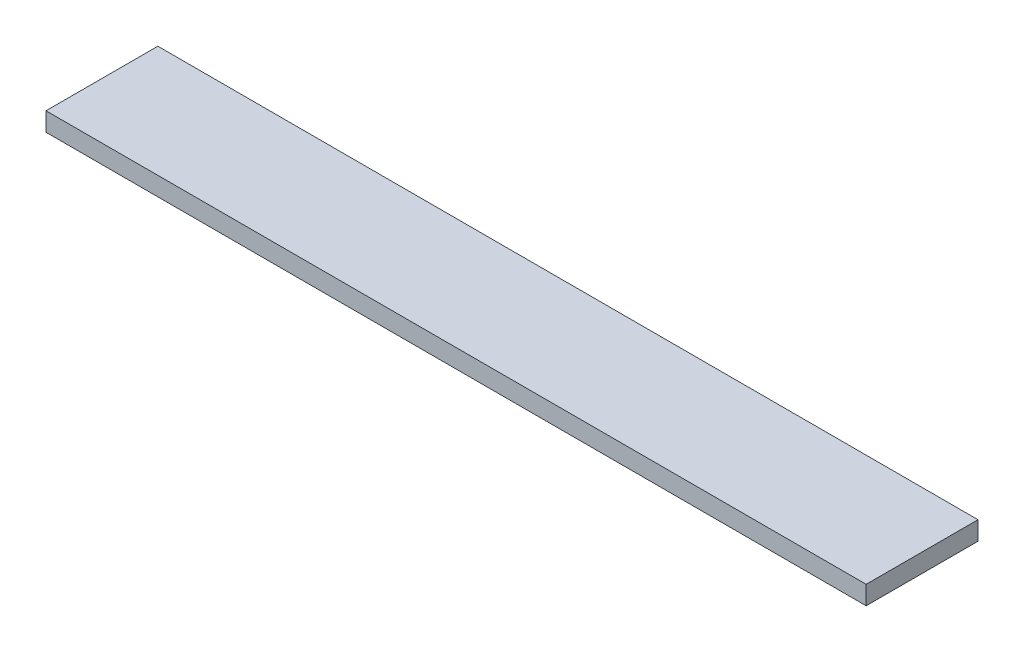
ISO-10303-21;
HEADER;
FILE_DESCRIPTION(('STEP AP214'),'2;1');
FILE_NAME('part.step','',(''),(''),'','','');
FILE_SCHEMA(('AUTOMOTIVE_DESIGN { 1 0 10303 214 1 1 1 1 }'));
ENDSEC;
DATA;
#1=APPLICATION_CONTEXT('core data for automotive mechanical design processes');
#2=APPLICATION_PROTOCOL_DEFINITION('international standard','automotive_design',2000,#1);
#3=PRODUCT_CONTEXT('',#1,'mechanical');
#4=PRODUCT('Part','Part','',(#3));
#5=PRODUCT_RELATED_PRODUCT_CATEGORY('part','',(#4));
#6=PRODUCT_DEFINITION_FORMATION('','',#4);
#7=PRODUCT_DEFINITION_CONTEXT('part definition',#1,'design');
#8=PRODUCT_DEFINITION('design','',#6,#7);
#9=PRODUCT_DEFINITION_SHAPE('','',#8);
#10=(LENGTH_UNIT() NAMED_UNIT(*) SI_UNIT(.MILLI.,.METRE.));
#11=(NAMED_UNIT(*) PLANE_ANGLE_UNIT() SI_UNIT($,.RADIAN.));
#12=(NAMED_UNIT(*) SI_UNIT($,.STERADIAN.) SOLID_ANGLE_UNIT());
#13=UNCERTAINTY_MEASURE_WITH_UNIT(LENGTH_MEASURE(1.E-05),#10,'distance_accuracy_value','');
#14=(GEOMETRIC_REPRESENTATION_CONTEXT(3) GLOBAL_UNCERTAINTY_ASSIGNED_CONTEXT((#13)) GLOBAL_UNIT_ASSIGNED_CONTEXT((#10,
#11,#12)) REPRESENTATION_CONTEXT('',''));
#15=CARTESIAN_POINT('',(0.,0.,0.));
#16=DIRECTION('',(0.,0.,1.));
#17=DIRECTION('',(1.,0.,0.));
#18=AXIS2_PLACEMENT_3D('',#15,#16,#17);
#19=CARTESIAN_POINT('',(0.,50.,0.));
#20=DIRECTION('',(1.,0.,0.));
#21=DIRECTION('',(0.,0.,-1.));
#22=AXIS2_PLACEMENT_3D('',#19,#20,#21);
#23=PLANE('',#22);
#24=DIRECTION('',(0.,0.,1.));
#25=VECTOR('',#24,1.);
#26=CARTESIAN_POINT('',(0.,0.,0.));
#27=LINE('',#26,#25);
#28=CARTESIAN_POINT('',(0.,0.,-300.));
#29=VERTEX_POINT('',#28);
#30=CARTESIAN_POINT('',(0.,0.,0.));
#31=VERTEX_POINT('',#30);
#32=EDGE_CURVE('E96',#29,#31,#27,.T.);
#33=ORIENTED_EDGE('',*,*,#32,.T.);
#34=DIRECTION('',(0.,-1.,0.));
#35=VECTOR('',#34,1.);
#36=CARTESIAN_POINT('',(0.,50.,0.));
#37=LINE('',#36,#35);
#38=CARTESIAN_POINT('',(0.,50.,0.));
#39=VERTEX_POINT('',#38);
#40=EDGE_CURVE('E11',#39,#31,#37,.T.);
#41=ORIENTED_EDGE('',*,*,#40,.F.);
#42=DIRECTION('',(0.,0.,1.));
#43=VECTOR('',#42,1.);
#44=CARTESIAN_POINT('',(0.,50.,0.));
#45=LINE('',#44,#43);
#46=CARTESIAN_POINT('',(0.,50.,-300.));
#47=VERTEX_POINT('',#46);
#48=EDGE_CURVE('E84',#47,#39,#45,.T.);
#49=ORIENTED_EDGE('',*,*,#48,.F.);
#50=DIRECTION('',(0.,-1.,0.));
#51=VECTOR('',#50,1.);
#52=CARTESIAN_POINT('',(0.,50.,-300.));
#53=LINE('',#52,#51);
#54=EDGE_CURVE('E92',#47,#29,#53,.T.);
#55=ORIENTED_EDGE('',*,*,#54,.T.);
#56=EDGE_LOOP('',(#33,#41,#49,#55));
#57=FACE_BOUND('',#56,.T.);
#58=ADVANCED_FACE('F33',(#57),#23,.F.);
#59=CARTESIAN_POINT('',(0.,50.,0.));
#60=DIRECTION('',(0.,0.,-1.));
#61=DIRECTION('',(-1.,0.,0.));
#62=AXIS2_PLACEMENT_3D('',#59,#60,#61);
#63=PLANE('',#62);
#64=DIRECTION('',(1.,0.,0.));
#65=VECTOR('',#64,1.);
#66=CARTESIAN_POINT('',(0.,0.,0.));
#67=LINE('',#66,#65);
#68=CARTESIAN_POINT('',(2200.,0.,0.));
#69=VERTEX_POINT('',#68);
#70=EDGE_CURVE('E88',#31,#69,#67,.T.);
#71=ORIENTED_EDGE('',*,*,#70,.T.);
#72=DIRECTION('',(0.,-1.,0.));
#73=VECTOR('',#72,1.);
#74=CARTESIAN_POINT('',(2200.,50.,0.));
#75=LINE('',#74,#73);
#76=CARTESIAN_POINT('',(2200.,50.,0.));
#77=VERTEX_POINT('',#76);
#78=EDGE_CURVE('E41',#77,#69,#75,.T.);
#79=ORIENTED_EDGE('',*,*,#78,.F.);
#80=DIRECTION('',(1.,0.,0.));
#81=VECTOR('',#80,1.);
#82=CARTESIAN_POINT('',(0.,50.,0.));
#83=LINE('',#82,#81);
#84=EDGE_CURVE('E79',#39,#77,#83,.T.);
#85=ORIENTED_EDGE('',*,*,#84,.F.);
#86=ORIENTED_EDGE('',*,*,#40,.T.);
#87=EDGE_LOOP('',(#71,#79,#85,#86));
#88=FACE_BOUND('',#87,.T.);
#89=ADVANCED_FACE('F87',(#88),#63,.F.);
#90=CARTESIAN_POINT('',(2200.,50.,0.));
#91=DIRECTION('',(-1.,0.,0.));
#92=DIRECTION('',(0.,0.,1.));
#93=AXIS2_PLACEMENT_3D('',#90,#91,#92);
#94=PLANE('',#93);
#95=DIRECTION('',(0.,0.,-1.));
#96=VECTOR('',#95,1.);
#97=CARTESIAN_POINT('',(2200.,0.,0.));
#98=LINE('',#97,#96);
#99=CARTESIAN_POINT('',(2200.,0.,-300.));
#100=VERTEX_POINT('',#99);
#101=EDGE_CURVE('E66',#69,#100,#98,.T.);
#102=ORIENTED_EDGE('',*,*,#101,.T.);
#103=DIRECTION('',(0.,-1.,0.));
#104=VECTOR('',#103,1.);
#105=CARTESIAN_POINT('',(2200.,50.,-300.));
#106=LINE('',#105,#104);
#107=CARTESIAN_POINT('',(2200.,50.,-300.));
#108=VERTEX_POINT('',#107);
#109=EDGE_CURVE('E89',#108,#100,#106,.T.);
#110=ORIENTED_EDGE('',*,*,#109,.F.);
#111=DIRECTION('',(0.,0.,-1.));
#112=VECTOR('',#111,1.);
#113=CARTESIAN_POINT('',(2200.,50.,0.));
#114=LINE('',#113,#112);
#115=EDGE_CURVE('E82',#77,#108,#114,.T.);
#116=ORIENTED_EDGE('',*,*,#115,.F.);
#117=ORIENTED_EDGE('',*,*,#78,.T.);
#118=EDGE_LOOP('',(#102,#110,#116,#117));
#119=FACE_BOUND('',#118,.T.);
#120=ADVANCED_FACE('F90',(#119),#94,.F.);
#121=CARTESIAN_POINT('',(0.,50.,-300.));
#122=DIRECTION('',(0.,0.,1.));
#123=DIRECTION('',(1.,0.,0.));
#124=AXIS2_PLACEMENT_3D('',#121,#122,#123);
#125=PLANE('',#124);
#126=DIRECTION('',(-1.,0.,0.));
#127=VECTOR('',#126,1.);
#128=CARTESIAN_POINT('',(0.,0.,-300.));
#129=LINE('',#128,#127);
#130=EDGE_CURVE('E72',#100,#29,#129,.T.);
#131=ORIENTED_EDGE('',*,*,#130,.T.);
#132=ORIENTED_EDGE('',*,*,#54,.F.);
#133=DIRECTION('',(-1.,0.,0.));
#134=VECTOR('',#133,1.);
#135=CARTESIAN_POINT('',(0.,50.,-300.));
#136=LINE('',#135,#134);
#137=EDGE_CURVE('E49',#108,#47,#136,.T.);
#138=ORIENTED_EDGE('',*,*,#137,.F.);
#139=ORIENTED_EDGE('',*,*,#109,.T.);
#140=EDGE_LOOP('',(#131,#132,#138,#139));
#141=FACE_BOUND('',#140,.T.);
#142=ADVANCED_FACE('F103',(#141),#125,.F.);
#143=CARTESIAN_POINT('',(0.,50.,0.));
#144=DIRECTION('',(0.,-1.,0.));
#145=DIRECTION('',(0.,0.,-1.));
#146=AXIS2_PLACEMENT_3D('',#143,#144,#145);
#147=PLANE('',#146);
#148=ORIENTED_EDGE('',*,*,#48,.T.);
#149=ORIENTED_EDGE('',*,*,#84,.T.);
#150=ORIENTED_EDGE('',*,*,#115,.T.);
#151=ORIENTED_EDGE('',*,*,#137,.T.);
#152=EDGE_LOOP('',(#148,#149,#150,#151));
#153=FACE_BOUND('',#152,.T.);
#154=ADVANCED_FACE('F80',(#153),#147,.F.);
#155=CARTESIAN_POINT('',(0.,0.,0.));
#156=DIRECTION('',(0.,-1.,0.));
#157=DIRECTION('',(0.,0.,-1.));
#158=AXIS2_PLACEMENT_3D('',#155,#156,#157);
#159=PLANE('',#158);
#160=ORIENTED_EDGE('',*,*,#32,.F.);
#161=ORIENTED_EDGE('',*,*,#130,.F.);
#162=ORIENTED_EDGE('',*,*,#101,.F.);
#163=ORIENTED_EDGE('',*,*,#70,.F.);
#164=EDGE_LOOP('',(#160,#161,#162,#163));
#165=FACE_BOUND('',#164,.T.);
#166=ADVANCED_FACE('F106',(#165),#159,.T.);
#167=CLOSED_SHELL('',(#58,#89,#120,#142,#154,#166));
#168=MANIFOLD_SOLID_BREP('B2',#167);
#169=ADVANCED_BREP_SHAPE_REPRESENTATION('',(#18,#168),#14);
#170=SHAPE_DEFINITION_REPRESENTATION(#9,#169);
ENDSEC;
END-ISO-10303-21;
